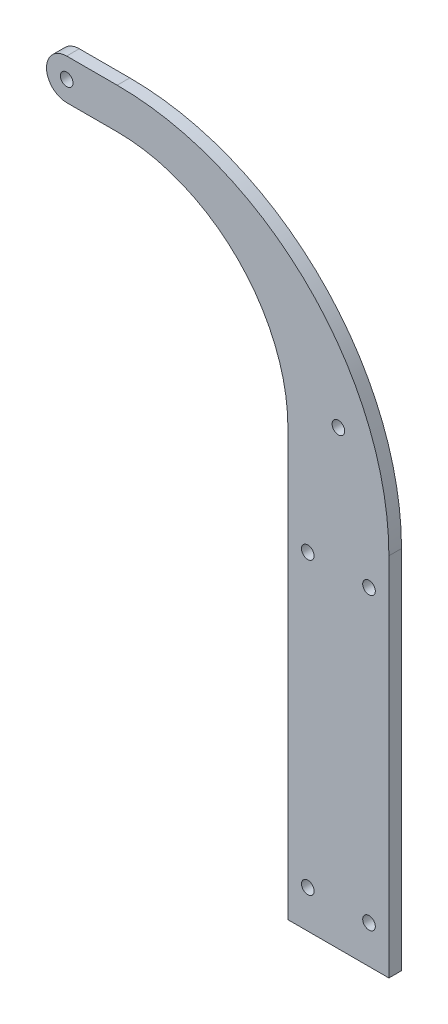
ISO-10303-21;
HEADER;
FILE_DESCRIPTION(('STEP AP214'),'2;1');
FILE_NAME('part.step','',(''),(''),'','','');
FILE_SCHEMA(('AUTOMOTIVE_DESIGN { 1 0 10303 214 1 1 1 1 }'));
ENDSEC;
DATA;
#1=APPLICATION_CONTEXT('core data for automotive mechanical design processes');
#2=APPLICATION_PROTOCOL_DEFINITION('international standard','automotive_design',2000,#1);
#3=PRODUCT_CONTEXT('',#1,'mechanical');
#4=PRODUCT('Part','Part','',(#3));
#5=PRODUCT_RELATED_PRODUCT_CATEGORY('part','',(#4));
#6=PRODUCT_DEFINITION_FORMATION('','',#4);
#7=PRODUCT_DEFINITION_CONTEXT('part definition',#1,'design');
#8=PRODUCT_DEFINITION('design','',#6,#7);
#9=PRODUCT_DEFINITION_SHAPE('','',#8);
#10=(LENGTH_UNIT() NAMED_UNIT(*) SI_UNIT(.MILLI.,.METRE.));
#11=(NAMED_UNIT(*) PLANE_ANGLE_UNIT() SI_UNIT($,.RADIAN.));
#12=(NAMED_UNIT(*) SI_UNIT($,.STERADIAN.) SOLID_ANGLE_UNIT());
#13=UNCERTAINTY_MEASURE_WITH_UNIT(LENGTH_MEASURE(1.E-05),#10,'distance_accuracy_value','');
#14=(GEOMETRIC_REPRESENTATION_CONTEXT(3) GLOBAL_UNCERTAINTY_ASSIGNED_CONTEXT((#13)) GLOBAL_UNIT_ASSIGNED_CONTEXT((#10,
#11,#12)) REPRESENTATION_CONTEXT('',''));
#15=CARTESIAN_POINT('',(0.,0.,0.));
#16=DIRECTION('',(0.,0.,1.));
#17=DIRECTION('',(1.,0.,0.));
#18=AXIS2_PLACEMENT_3D('',#15,#16,#17);
#19=CARTESIAN_POINT('',(0.,0.,6.35));
#20=DIRECTION('',(0.,0.,1.));
#21=DIRECTION('',(1.,0.,0.));
#22=AXIS2_PLACEMENT_3D('',#19,#20,#21);
#23=PLANE('',#22);
#24=CARTESIAN_POINT('',(121.3,-145.382187260854,6.35));
#25=DIRECTION('',(0.,0.,1.));
#26=DIRECTION('',(1.,0.,0.));
#27=AXIS2_PLACEMENT_3D('',#24,#25,#26);
#28=CIRCLE('',#27,3.175);
#29=CARTESIAN_POINT('',(124.475,-145.382187260854,6.35));
#30=VERTEX_POINT('',#29);
#31=EDGE_CURVE('E204',#30,#30,#28,.T.);
#32=ORIENTED_EDGE('',*,*,#31,.F.);
#33=EDGE_LOOP('',(#32));
#34=FACE_BOUND('',#33,.T.);
#35=CARTESIAN_POINT('',(136.7,-83.3599999999999,6.35));
#36=DIRECTION('',(0.,0.,1.));
#37=DIRECTION('',(1.,0.,0.));
#38=AXIS2_PLACEMENT_3D('',#35,#36,#37);
#39=CIRCLE('',#38,3.175);
#40=CARTESIAN_POINT('',(139.875,-83.3599999999999,6.35));
#41=VERTEX_POINT('',#40);
#42=EDGE_CURVE('E192',#41,#41,#39,.T.);
#43=ORIENTED_EDGE('',*,*,#42,.F.);
#44=EDGE_LOOP('',(#43));
#45=FACE_BOUND('',#44,.T.);
#46=CARTESIAN_POINT('',(0.,0.,6.35));
#47=DIRECTION('',(0.,0.,1.));
#48=DIRECTION('',(1.,0.,0.));
#49=AXIS2_PLACEMENT_3D('',#46,#47,#48);
#50=CIRCLE('',#49,3.175);
#51=CARTESIAN_POINT('',(3.175,0.,6.35));
#52=VERTEX_POINT('',#51);
#53=EDGE_CURVE('E138',#52,#52,#50,.T.);
#54=ORIENTED_EDGE('',*,*,#53,.F.);
#55=EDGE_LOOP('',(#54));
#56=FACE_BOUND('',#55,.T.);
#57=CARTESIAN_POINT('',(0.,0.,6.35));
#58=DIRECTION('',(0.,0.,1.));
#59=DIRECTION('',(1.,0.,0.));
#60=AXIS2_PLACEMENT_3D('',#57,#58,#59);
#61=CIRCLE('',#60,10.16);
#62=CARTESIAN_POINT('',(0.,10.16,6.35));
#63=VERTEX_POINT('',#62);
#64=CARTESIAN_POINT('',(0.,-10.16,6.35));
#65=VERTEX_POINT('',#64);
#66=EDGE_CURVE('E149',#63,#65,#61,.T.);
#67=ORIENTED_EDGE('',*,*,#66,.T.);
#68=DIRECTION('',(1.,0.,0.));
#69=VECTOR('',#68,1.);
#70=CARTESIAN_POINT('',(0.,-10.16,6.35));
#71=LINE('',#70,#69);
#72=CARTESIAN_POINT('',(25.4,-10.16,6.35));
#73=VERTEX_POINT('',#72);
#74=EDGE_CURVE('E97',#65,#73,#71,.T.);
#75=ORIENTED_EDGE('',*,*,#74,.T.);
#76=CARTESIAN_POINT('',(25.4,-96.06,6.35));
#77=DIRECTION('',(0.,0.,-1.));
#78=DIRECTION('',(-1.,0.,0.));
#79=AXIS2_PLACEMENT_3D('',#76,#77,#78);
#80=CIRCLE('',#79,85.9);
#81=CARTESIAN_POINT('',(111.3,-96.06,6.35));
#82=VERTEX_POINT('',#81);
#83=EDGE_CURVE('E164',#73,#82,#80,.T.);
#84=ORIENTED_EDGE('',*,*,#83,.T.);
#85=DIRECTION('',(0.,-1.,0.));
#86=VECTOR('',#85,1.);
#87=CARTESIAN_POINT('',(111.3,-96.06,6.35));
#88=LINE('',#87,#86);
#89=CARTESIAN_POINT('',(111.3,-310.482187260854,6.35));
#90=VERTEX_POINT('',#89);
#91=EDGE_CURVE('E177',#82,#90,#88,.T.);
#92=ORIENTED_EDGE('',*,*,#91,.T.);
#93=DIRECTION('',(1.,0.,0.));
#94=VECTOR('',#93,1.);
#95=CARTESIAN_POINT('',(111.3,-310.482187260854,6.35));
#96=LINE('',#95,#94);
#97=CARTESIAN_POINT('',(162.1,-310.482187260854,6.35));
#98=VERTEX_POINT('',#97);
#99=EDGE_CURVE('E116',#90,#98,#96,.T.);
#100=ORIENTED_EDGE('',*,*,#99,.T.);
#101=DIRECTION('',(0.,1.,0.));
#102=VECTOR('',#101,1.);
#103=CARTESIAN_POINT('',(162.1,-310.482187260854,6.35));
#104=LINE('',#103,#102);
#105=CARTESIAN_POINT('',(162.1,-126.54,6.35));
#106=VERTEX_POINT('',#105);
#107=EDGE_CURVE('E110',#98,#106,#104,.T.);
#108=ORIENTED_EDGE('',*,*,#107,.T.);
#109=CARTESIAN_POINT('',(25.4,-126.54,6.35));
#110=DIRECTION('',(0.,0.,1.));
#111=DIRECTION('',(-1.,0.,0.));
#112=AXIS2_PLACEMENT_3D('',#109,#110,#111);
#113=CIRCLE('',#112,136.7);
#114=CARTESIAN_POINT('',(25.4,10.16,6.35));
#115=VERTEX_POINT('',#114);
#116=EDGE_CURVE('E114',#106,#115,#113,.T.);
#117=ORIENTED_EDGE('',*,*,#116,.T.);
#118=DIRECTION('',(-1.,0.,0.));
#119=VECTOR('',#118,1.);
#120=CARTESIAN_POINT('',(0.,10.16,6.35));
#121=LINE('',#120,#119);
#122=EDGE_CURVE('E54',#115,#63,#121,.T.);
#123=ORIENTED_EDGE('',*,*,#122,.T.);
#124=EDGE_LOOP('',(#67,#75,#84,#92,#100,#108,#117,#123));
#125=FACE_BOUND('',#124,.T.);
#126=CARTESIAN_POINT('',(121.3,-291.432187260854,6.35));
#127=DIRECTION('',(0.,0.,1.));
#128=DIRECTION('',(1.,0.,0.));
#129=AXIS2_PLACEMENT_3D('',#126,#127,#128);
#130=CIRCLE('',#129,3.175);
#131=CARTESIAN_POINT('',(124.475,-291.432187260854,6.35));
#132=VERTEX_POINT('',#131);
#133=EDGE_CURVE('E186',#132,#132,#130,.T.);
#134=ORIENTED_EDGE('',*,*,#133,.F.);
#135=EDGE_LOOP('',(#134));
#136=FACE_BOUND('',#135,.T.);
#137=CARTESIAN_POINT('',(152.1,-291.432187260854,6.35));
#138=DIRECTION('',(0.,0.,1.));
#139=DIRECTION('',(1.,0.,0.));
#140=AXIS2_PLACEMENT_3D('',#137,#138,#139);
#141=CIRCLE('',#140,3.175);
#142=CARTESIAN_POINT('',(155.275,-291.432187260854,6.35));
#143=VERTEX_POINT('',#142);
#144=EDGE_CURVE('E198',#143,#143,#141,.T.);
#145=ORIENTED_EDGE('',*,*,#144,.F.);
#146=EDGE_LOOP('',(#145));
#147=FACE_BOUND('',#146,.T.);
#148=CARTESIAN_POINT('',(152.1,-145.382187260854,6.35));
#149=DIRECTION('',(0.,0.,1.));
#150=DIRECTION('',(1.,0.,0.));
#151=AXIS2_PLACEMENT_3D('',#148,#149,#150);
#152=CIRCLE('',#151,3.17499999999997);
#153=CARTESIAN_POINT('',(155.275,-145.382187260854,6.35));
#154=VERTEX_POINT('',#153);
#155=EDGE_CURVE('E210',#154,#154,#152,.T.);
#156=ORIENTED_EDGE('',*,*,#155,.F.);
#157=EDGE_LOOP('',(#156));
#158=FACE_BOUND('',#157,.T.);
#159=ADVANCED_FACE('F37',(#34,#45,#56,#125,#136,#147,#158),#23,.T.);
#160=CARTESIAN_POINT('',(0.,0.,0.));
#161=DIRECTION('',(0.,0.,1.));
#162=DIRECTION('',(1.,0.,0.));
#163=AXIS2_PLACEMENT_3D('',#160,#161,#162);
#164=PLANE('',#163);
#165=CARTESIAN_POINT('',(0.,0.,0.));
#166=DIRECTION('',(0.,0.,1.));
#167=DIRECTION('',(1.,0.,0.));
#168=AXIS2_PLACEMENT_3D('',#165,#166,#167);
#169=CIRCLE('',#168,10.16);
#170=CARTESIAN_POINT('',(0.,10.16,0.));
#171=VERTEX_POINT('',#170);
#172=CARTESIAN_POINT('',(0.,-10.16,0.));
#173=VERTEX_POINT('',#172);
#174=EDGE_CURVE('E134',#171,#173,#169,.T.);
#175=ORIENTED_EDGE('',*,*,#174,.F.);
#176=DIRECTION('',(-1.,0.,0.));
#177=VECTOR('',#176,1.);
#178=CARTESIAN_POINT('',(0.,10.16,0.));
#179=LINE('',#178,#177);
#180=CARTESIAN_POINT('',(25.4,10.16,0.));
#181=VERTEX_POINT('',#180);
#182=EDGE_CURVE('E89',#181,#171,#179,.T.);
#183=ORIENTED_EDGE('',*,*,#182,.F.);
#184=CARTESIAN_POINT('',(25.4,-126.54,0.));
#185=DIRECTION('',(0.,0.,1.));
#186=DIRECTION('',(-1.,0.,0.));
#187=AXIS2_PLACEMENT_3D('',#184,#185,#186);
#188=CIRCLE('',#187,136.7);
#189=CARTESIAN_POINT('',(162.1,-126.54,0.));
#190=VERTEX_POINT('',#189);
#191=EDGE_CURVE('E83',#190,#181,#188,.T.);
#192=ORIENTED_EDGE('',*,*,#191,.F.);
#193=DIRECTION('',(0.,1.,0.));
#194=VECTOR('',#193,1.);
#195=CARTESIAN_POINT('',(162.1,-310.482187260854,0.));
#196=LINE('',#195,#194);
#197=CARTESIAN_POINT('',(162.1,-310.482187260854,0.));
#198=VERTEX_POINT('',#197);
#199=EDGE_CURVE('E124',#198,#190,#196,.T.);
#200=ORIENTED_EDGE('',*,*,#199,.F.);
#201=DIRECTION('',(1.,0.,0.));
#202=VECTOR('',#201,1.);
#203=CARTESIAN_POINT('',(111.3,-310.482187260854,0.));
#204=LINE('',#203,#202);
#205=CARTESIAN_POINT('',(111.3,-310.482187260854,0.));
#206=VERTEX_POINT('',#205);
#207=EDGE_CURVE('E144',#206,#198,#204,.T.);
#208=ORIENTED_EDGE('',*,*,#207,.F.);
#209=DIRECTION('',(0.,-1.,0.));
#210=VECTOR('',#209,1.);
#211=CARTESIAN_POINT('',(111.3,-96.06,0.));
#212=LINE('',#211,#210);
#213=CARTESIAN_POINT('',(111.3,-96.06,0.));
#214=VERTEX_POINT('',#213);
#215=EDGE_CURVE('E142',#214,#206,#212,.T.);
#216=ORIENTED_EDGE('',*,*,#215,.F.);
#217=CARTESIAN_POINT('',(25.4,-96.06,0.));
#218=DIRECTION('',(0.,0.,-1.));
#219=DIRECTION('',(-1.,0.,0.));
#220=AXIS2_PLACEMENT_3D('',#217,#218,#219);
#221=CIRCLE('',#220,85.9);
#222=CARTESIAN_POINT('',(25.4,-10.16,0.));
#223=VERTEX_POINT('',#222);
#224=EDGE_CURVE('E140',#223,#214,#221,.T.);
#225=ORIENTED_EDGE('',*,*,#224,.F.);
#226=DIRECTION('',(1.,0.,0.));
#227=VECTOR('',#226,1.);
#228=CARTESIAN_POINT('',(0.,-10.16,0.));
#229=LINE('',#228,#227);
#230=EDGE_CURVE('E137',#173,#223,#229,.T.);
#231=ORIENTED_EDGE('',*,*,#230,.F.);
#232=EDGE_LOOP('',(#175,#183,#192,#200,#208,#216,#225,#231));
#233=FACE_BOUND('',#232,.T.);
#234=CARTESIAN_POINT('',(0.,0.,0.));
#235=DIRECTION('',(0.,0.,1.));
#236=DIRECTION('',(1.,0.,0.));
#237=AXIS2_PLACEMENT_3D('',#234,#235,#236);
#238=CIRCLE('',#237,3.175);
#239=CARTESIAN_POINT('',(3.175,0.,0.));
#240=VERTEX_POINT('',#239);
#241=EDGE_CURVE('E183',#240,#240,#238,.T.);
#242=ORIENTED_EDGE('',*,*,#241,.T.);
#243=EDGE_LOOP('',(#242));
#244=FACE_BOUND('',#243,.T.);
#245=CARTESIAN_POINT('',(121.3,-291.432187260854,0.));
#246=DIRECTION('',(0.,0.,1.));
#247=DIRECTION('',(1.,0.,0.));
#248=AXIS2_PLACEMENT_3D('',#245,#246,#247);
#249=CIRCLE('',#248,3.175);
#250=CARTESIAN_POINT('',(124.475,-291.432187260854,0.));
#251=VERTEX_POINT('',#250);
#252=EDGE_CURVE('E189',#251,#251,#249,.T.);
#253=ORIENTED_EDGE('',*,*,#252,.T.);
#254=EDGE_LOOP('',(#253));
#255=FACE_BOUND('',#254,.T.);
#256=CARTESIAN_POINT('',(136.7,-83.3599999999999,0.));
#257=DIRECTION('',(0.,0.,1.));
#258=DIRECTION('',(1.,0.,0.));
#259=AXIS2_PLACEMENT_3D('',#256,#257,#258);
#260=CIRCLE('',#259,3.175);
#261=CARTESIAN_POINT('',(139.875,-83.3599999999999,0.));
#262=VERTEX_POINT('',#261);
#263=EDGE_CURVE('E195',#262,#262,#260,.T.);
#264=ORIENTED_EDGE('',*,*,#263,.T.);
#265=EDGE_LOOP('',(#264));
#266=FACE_BOUND('',#265,.T.);
#267=CARTESIAN_POINT('',(152.1,-291.432187260854,0.));
#268=DIRECTION('',(0.,0.,1.));
#269=DIRECTION('',(1.,0.,0.));
#270=AXIS2_PLACEMENT_3D('',#267,#268,#269);
#271=CIRCLE('',#270,3.175);
#272=CARTESIAN_POINT('',(155.275,-291.432187260854,0.));
#273=VERTEX_POINT('',#272);
#274=EDGE_CURVE('E201',#273,#273,#271,.T.);
#275=ORIENTED_EDGE('',*,*,#274,.T.);
#276=EDGE_LOOP('',(#275));
#277=FACE_BOUND('',#276,.T.);
#278=CARTESIAN_POINT('',(121.3,-145.382187260854,0.));
#279=DIRECTION('',(0.,0.,1.));
#280=DIRECTION('',(1.,0.,0.));
#281=AXIS2_PLACEMENT_3D('',#278,#279,#280);
#282=CIRCLE('',#281,3.175);
#283=CARTESIAN_POINT('',(124.475,-145.382187260854,0.));
#284=VERTEX_POINT('',#283);
#285=EDGE_CURVE('E207',#284,#284,#282,.T.);
#286=ORIENTED_EDGE('',*,*,#285,.T.);
#287=EDGE_LOOP('',(#286));
#288=FACE_BOUND('',#287,.T.);
#289=CARTESIAN_POINT('',(152.1,-145.382187260854,0.));
#290=DIRECTION('',(0.,0.,1.));
#291=DIRECTION('',(1.,0.,0.));
#292=AXIS2_PLACEMENT_3D('',#289,#290,#291);
#293=CIRCLE('',#292,3.17499999999997);
#294=CARTESIAN_POINT('',(155.275,-145.382187260854,0.));
#295=VERTEX_POINT('',#294);
#296=EDGE_CURVE('E213',#295,#295,#293,.T.);
#297=ORIENTED_EDGE('',*,*,#296,.T.);
#298=EDGE_LOOP('',(#297));
#299=FACE_BOUND('',#298,.T.);
#300=ADVANCED_FACE('F168',(#233,#244,#255,#266,#277,#288,#299),#164,.F.);
#301=CARTESIAN_POINT('',(0.,0.,6.35));
#302=DIRECTION('',(0.,0.,-1.));
#303=DIRECTION('',(-1.,0.,0.));
#304=AXIS2_PLACEMENT_3D('',#301,#302,#303);
#305=CYLINDRICAL_SURFACE('',#304,10.16);
#306=ORIENTED_EDGE('',*,*,#174,.T.);
#307=DIRECTION('',(0.,0.,-1.));
#308=VECTOR('',#307,1.);
#309=CARTESIAN_POINT('',(0.,-10.16,6.35));
#310=LINE('',#309,#308);
#311=EDGE_CURVE('E11',#65,#173,#310,.T.);
#312=ORIENTED_EDGE('',*,*,#311,.F.);
#313=ORIENTED_EDGE('',*,*,#66,.F.);
#314=DIRECTION('',(0.,0.,-1.));
#315=VECTOR('',#314,1.);
#316=CARTESIAN_POINT('',(0.,10.16,6.35));
#317=LINE('',#316,#315);
#318=EDGE_CURVE('E130',#63,#171,#317,.T.);
#319=ORIENTED_EDGE('',*,*,#318,.T.);
#320=EDGE_LOOP('',(#306,#312,#313,#319));
#321=FACE_BOUND('',#320,.T.);
#322=ADVANCED_FACE('F39',(#321),#305,.T.);
#323=CARTESIAN_POINT('',(0.,-10.16,6.35));
#324=DIRECTION('',(0.,1.,0.));
#325=DIRECTION('',(0.,0.,1.));
#326=AXIS2_PLACEMENT_3D('',#323,#324,#325);
#327=PLANE('',#326);
#328=ORIENTED_EDGE('',*,*,#230,.T.);
#329=DIRECTION('',(0.,0.,-1.));
#330=VECTOR('',#329,1.);
#331=CARTESIAN_POINT('',(25.4,-10.16,6.35));
#332=LINE('',#331,#330);
#333=EDGE_CURVE('E46',#73,#223,#332,.T.);
#334=ORIENTED_EDGE('',*,*,#333,.F.);
#335=ORIENTED_EDGE('',*,*,#74,.F.);
#336=ORIENTED_EDGE('',*,*,#311,.T.);
#337=EDGE_LOOP('',(#328,#334,#335,#336));
#338=FACE_BOUND('',#337,.T.);
#339=ADVANCED_FACE('F247',(#338),#327,.F.);
#340=CARTESIAN_POINT('',(25.4,-96.06,6.35));
#341=DIRECTION('',(0.,0.,-1.));
#342=DIRECTION('',(-1.,0.,0.));
#343=AXIS2_PLACEMENT_3D('',#340,#341,#342);
#344=CYLINDRICAL_SURFACE('',#343,85.9);
#345=ORIENTED_EDGE('',*,*,#224,.T.);
#346=DIRECTION('',(0.,0.,-1.));
#347=VECTOR('',#346,1.);
#348=CARTESIAN_POINT('',(111.3,-96.06,6.35));
#349=LINE('',#348,#347);
#350=EDGE_CURVE('E156',#82,#214,#349,.T.);
#351=ORIENTED_EDGE('',*,*,#350,.F.);
#352=ORIENTED_EDGE('',*,*,#83,.F.);
#353=ORIENTED_EDGE('',*,*,#333,.T.);
#354=EDGE_LOOP('',(#345,#351,#352,#353));
#355=FACE_BOUND('',#354,.T.);
#356=ADVANCED_FACE('F162',(#355),#344,.F.);
#357=CARTESIAN_POINT('',(111.3,-96.06,6.35));
#358=DIRECTION('',(1.,0.,0.));
#359=DIRECTION('',(0.,1.,0.));
#360=AXIS2_PLACEMENT_3D('',#357,#358,#359);
#361=PLANE('',#360);
#362=ORIENTED_EDGE('',*,*,#215,.T.);
#363=DIRECTION('',(0.,0.,-1.));
#364=VECTOR('',#363,1.);
#365=CARTESIAN_POINT('',(111.3,-310.482187260854,6.35));
#366=LINE('',#365,#364);
#367=EDGE_CURVE('E153',#90,#206,#366,.T.);
#368=ORIENTED_EDGE('',*,*,#367,.F.);
#369=ORIENTED_EDGE('',*,*,#91,.F.);
#370=ORIENTED_EDGE('',*,*,#350,.T.);
#371=EDGE_LOOP('',(#362,#368,#369,#370));
#372=FACE_BOUND('',#371,.T.);
#373=ADVANCED_FACE('F173',(#372),#361,.F.);
#374=CARTESIAN_POINT('',(111.3,-310.482187260854,6.35));
#375=DIRECTION('',(0.,1.,0.));
#376=DIRECTION('',(-1.,0.,0.));
#377=AXIS2_PLACEMENT_3D('',#374,#375,#376);
#378=PLANE('',#377);
#379=ORIENTED_EDGE('',*,*,#207,.T.);
#380=DIRECTION('',(0.,0.,-1.));
#381=VECTOR('',#380,1.);
#382=CARTESIAN_POINT('',(162.1,-310.482187260854,6.35));
#383=LINE('',#382,#381);
#384=EDGE_CURVE('E125',#98,#198,#383,.T.);
#385=ORIENTED_EDGE('',*,*,#384,.F.);
#386=ORIENTED_EDGE('',*,*,#99,.F.);
#387=ORIENTED_EDGE('',*,*,#367,.T.);
#388=EDGE_LOOP('',(#379,#385,#386,#387));
#389=FACE_BOUND('',#388,.T.);
#390=ADVANCED_FACE('F176',(#389),#378,.F.);
#391=CARTESIAN_POINT('',(162.1,-310.482187260854,6.35));
#392=DIRECTION('',(-1.,0.,0.));
#393=DIRECTION('',(0.,0.,1.));
#394=AXIS2_PLACEMENT_3D('',#391,#392,#393);
#395=PLANE('',#394);
#396=ORIENTED_EDGE('',*,*,#199,.T.);
#397=DIRECTION('',(0.,0.,-1.));
#398=VECTOR('',#397,1.);
#399=CARTESIAN_POINT('',(162.1,-126.54,6.35));
#400=LINE('',#399,#398);
#401=EDGE_CURVE('E121',#106,#190,#400,.T.);
#402=ORIENTED_EDGE('',*,*,#401,.F.);
#403=ORIENTED_EDGE('',*,*,#107,.F.);
#404=ORIENTED_EDGE('',*,*,#384,.T.);
#405=EDGE_LOOP('',(#396,#402,#403,#404));
#406=FACE_BOUND('',#405,.T.);
#407=ADVANCED_FACE('F122',(#406),#395,.F.);
#408=CARTESIAN_POINT('',(25.4,-126.54,6.35));
#409=DIRECTION('',(0.,0.,-1.));
#410=DIRECTION('',(-1.,0.,0.));
#411=AXIS2_PLACEMENT_3D('',#408,#409,#410);
#412=CYLINDRICAL_SURFACE('',#411,136.7);
#413=ORIENTED_EDGE('',*,*,#191,.T.);
#414=DIRECTION('',(0.,0.,-1.));
#415=VECTOR('',#414,1.);
#416=CARTESIAN_POINT('',(25.4,10.16,6.35));
#417=LINE('',#416,#415);
#418=EDGE_CURVE('E126',#115,#181,#417,.T.);
#419=ORIENTED_EDGE('',*,*,#418,.F.);
#420=ORIENTED_EDGE('',*,*,#116,.F.);
#421=ORIENTED_EDGE('',*,*,#401,.T.);
#422=EDGE_LOOP('',(#413,#419,#420,#421));
#423=FACE_BOUND('',#422,.T.);
#424=ADVANCED_FACE('F128',(#423),#412,.T.);
#425=CARTESIAN_POINT('',(0.,10.16,6.35));
#426=DIRECTION('',(0.,-1.,0.));
#427=DIRECTION('',(0.,0.,-1.));
#428=AXIS2_PLACEMENT_3D('',#425,#426,#427);
#429=PLANE('',#428);
#430=ORIENTED_EDGE('',*,*,#182,.T.);
#431=ORIENTED_EDGE('',*,*,#318,.F.);
#432=ORIENTED_EDGE('',*,*,#122,.F.);
#433=ORIENTED_EDGE('',*,*,#418,.T.);
#434=EDGE_LOOP('',(#430,#431,#432,#433));
#435=FACE_BOUND('',#434,.T.);
#436=ADVANCED_FACE('F235',(#435),#429,.F.);
#437=CARTESIAN_POINT('',(0.,0.,6.35));
#438=DIRECTION('',(0.,0.,-1.));
#439=DIRECTION('',(-1.,0.,0.));
#440=AXIS2_PLACEMENT_3D('',#437,#438,#439);
#441=CYLINDRICAL_SURFACE('',#440,3.175);
#442=ORIENTED_EDGE('',*,*,#53,.T.);
#443=EDGE_LOOP('',(#442));
#444=FACE_BOUND('',#443,.T.);
#445=ORIENTED_EDGE('',*,*,#241,.F.);
#446=EDGE_LOOP('',(#445));
#447=FACE_BOUND('',#446,.T.);
#448=ADVANCED_FACE('F232',(#444,#447),#441,.F.);
#449=CARTESIAN_POINT('',(121.3,-291.432187260854,6.35));
#450=DIRECTION('',(0.,0.,-1.));
#451=DIRECTION('',(-1.,0.,0.));
#452=AXIS2_PLACEMENT_3D('',#449,#450,#451);
#453=CYLINDRICAL_SURFACE('',#452,3.175);
#454=ORIENTED_EDGE('',*,*,#133,.T.);
#455=EDGE_LOOP('',(#454));
#456=FACE_BOUND('',#455,.T.);
#457=ORIENTED_EDGE('',*,*,#252,.F.);
#458=EDGE_LOOP('',(#457));
#459=FACE_BOUND('',#458,.T.);
#460=ADVANCED_FACE('F323',(#456,#459),#453,.F.);
#461=CARTESIAN_POINT('',(136.7,-83.3599999999999,6.35));
#462=DIRECTION('',(0.,0.,-1.));
#463=DIRECTION('',(-1.,0.,0.));
#464=AXIS2_PLACEMENT_3D('',#461,#462,#463);
#465=CYLINDRICAL_SURFACE('',#464,3.175);
#466=ORIENTED_EDGE('',*,*,#42,.T.);
#467=EDGE_LOOP('',(#466));
#468=FACE_BOUND('',#467,.T.);
#469=ORIENTED_EDGE('',*,*,#263,.F.);
#470=EDGE_LOOP('',(#469));
#471=FACE_BOUND('',#470,.T.);
#472=ADVANCED_FACE('F332',(#468,#471),#465,.F.);
#473=CARTESIAN_POINT('',(152.1,-291.432187260854,6.35));
#474=DIRECTION('',(0.,0.,-1.));
#475=DIRECTION('',(-1.,0.,0.));
#476=AXIS2_PLACEMENT_3D('',#473,#474,#475);
#477=CYLINDRICAL_SURFACE('',#476,3.175);
#478=ORIENTED_EDGE('',*,*,#144,.T.);
#479=EDGE_LOOP('',(#478));
#480=FACE_BOUND('',#479,.T.);
#481=ORIENTED_EDGE('',*,*,#274,.F.);
#482=EDGE_LOOP('',(#481));
#483=FACE_BOUND('',#482,.T.);
#484=ADVANCED_FACE('F341',(#480,#483),#477,.F.);
#485=CARTESIAN_POINT('',(121.3,-145.382187260854,6.35));
#486=DIRECTION('',(0.,0.,-1.));
#487=DIRECTION('',(-1.,0.,0.));
#488=AXIS2_PLACEMENT_3D('',#485,#486,#487);
#489=CYLINDRICAL_SURFACE('',#488,3.175);
#490=ORIENTED_EDGE('',*,*,#31,.T.);
#491=EDGE_LOOP('',(#490));
#492=FACE_BOUND('',#491,.T.);
#493=ORIENTED_EDGE('',*,*,#285,.F.);
#494=EDGE_LOOP('',(#493));
#495=FACE_BOUND('',#494,.T.);
#496=ADVANCED_FACE('F351',(#492,#495),#489,.F.);
#497=CARTESIAN_POINT('',(152.1,-145.382187260854,6.35));
#498=DIRECTION('',(0.,0.,-1.));
#499=DIRECTION('',(-1.,0.,0.));
#500=AXIS2_PLACEMENT_3D('',#497,#498,#499);
#501=CYLINDRICAL_SURFACE('',#500,3.17499999999997);
#502=ORIENTED_EDGE('',*,*,#155,.T.);
#503=EDGE_LOOP('',(#502));
#504=FACE_BOUND('',#503,.T.);
#505=ORIENTED_EDGE('',*,*,#296,.F.);
#506=EDGE_LOOP('',(#505));
#507=FACE_BOUND('',#506,.T.);
#508=ADVANCED_FACE('F219',(#504,#507),#501,.F.);
#509=CLOSED_SHELL('',(#159,#300,#322,#339,#356,#373,#390,#407,#424,#436,#448,#460,#472,#484,
#496,#508));
#510=MANIFOLD_SOLID_BREP('B2',#509);
#511=ADVANCED_BREP_SHAPE_REPRESENTATION('',(#18,#510),#14);
#512=SHAPE_DEFINITION_REPRESENTATION(#9,#511);
ENDSEC;
END-ISO-10303-21;
